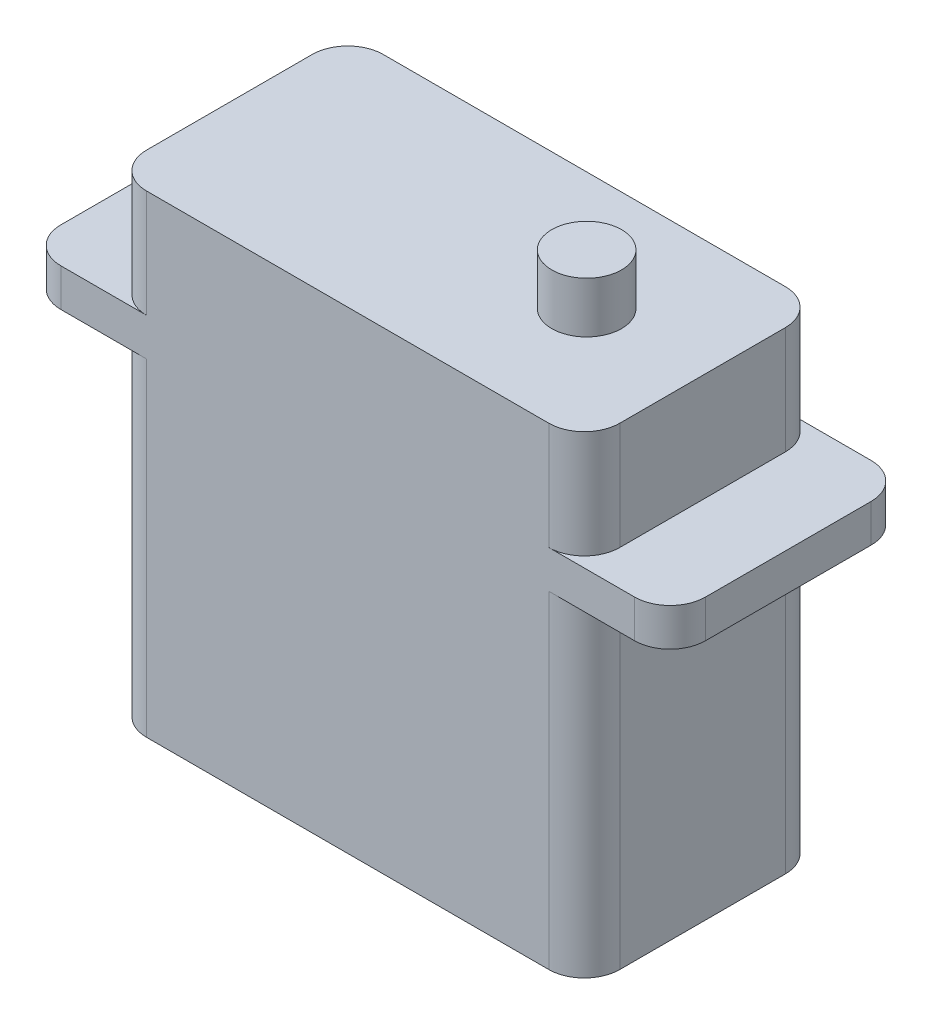
ISO-10303-21;
HEADER;
FILE_DESCRIPTION(('STEP AP214'),'2;1');
FILE_NAME('part.step','',(''),(''),'','','');
FILE_SCHEMA(('AUTOMOTIVE_DESIGN { 1 0 10303 214 1 1 1 1 }'));
ENDSEC;
DATA;
#1=APPLICATION_CONTEXT('core data for automotive mechanical design processes');
#2=APPLICATION_PROTOCOL_DEFINITION('international standard','automotive_design',2000,#1);
#3=PRODUCT_CONTEXT('',#1,'mechanical');
#4=PRODUCT('Part','Part','',(#3));
#5=PRODUCT_RELATED_PRODUCT_CATEGORY('part','',(#4));
#6=PRODUCT_DEFINITION_FORMATION('','',#4);
#7=PRODUCT_DEFINITION_CONTEXT('part definition',#1,'design');
#8=PRODUCT_DEFINITION('design','',#6,#7);
#9=PRODUCT_DEFINITION_SHAPE('','',#8);
#10=(LENGTH_UNIT() NAMED_UNIT(*) SI_UNIT(.MILLI.,.METRE.));
#11=(NAMED_UNIT(*) PLANE_ANGLE_UNIT() SI_UNIT($,.RADIAN.));
#12=(NAMED_UNIT(*) SI_UNIT($,.STERADIAN.) SOLID_ANGLE_UNIT());
#13=UNCERTAINTY_MEASURE_WITH_UNIT(LENGTH_MEASURE(1.E-05),#10,'distance_accuracy_value','');
#14=(GEOMETRIC_REPRESENTATION_CONTEXT(3) GLOBAL_UNCERTAINTY_ASSIGNED_CONTEXT((#13)) GLOBAL_UNIT_ASSIGNED_CONTEXT((#10,
#11,#12)) REPRESENTATION_CONTEXT('',''));
#15=CARTESIAN_POINT('',(0.,0.,0.));
#16=DIRECTION('',(0.,0.,1.));
#17=DIRECTION('',(1.,0.,0.));
#18=AXIS2_PLACEMENT_3D('',#15,#16,#17);
#19=CARTESIAN_POINT('',(20.,40.,10.));
#20=DIRECTION('',(-1.,0.,0.));
#21=DIRECTION('',(0.,0.,1.));
#22=AXIS2_PLACEMENT_3D('',#19,#20,#21);
#23=PLANE('',#22);
#24=DIRECTION('',(0.,0.,1.));
#25=VECTOR('',#24,1.);
#26=CARTESIAN_POINT('',(20.,30.9,10.));
#27=LINE('',#26,#25);
#28=CARTESIAN_POINT('',(20.,30.9,-7.));
#29=VERTEX_POINT('',#28);
#30=CARTESIAN_POINT('',(20.,30.9,7.));
#31=VERTEX_POINT('',#30);
#32=EDGE_CURVE('E341',#29,#31,#27,.T.);
#33=ORIENTED_EDGE('',*,*,#32,.F.);
#34=DIRECTION('',(0.,-1.,0.));
#35=VECTOR('',#34,1.);
#36=CARTESIAN_POINT('',(20.,40.,-7.));
#37=LINE('',#36,#35);
#38=CARTESIAN_POINT('',(20.,40.,-7.));
#39=VERTEX_POINT('',#38);
#40=EDGE_CURVE('E281',#29,#39,#37,.F.);
#41=ORIENTED_EDGE('',*,*,#40,.T.);
#42=DIRECTION('',(0.,0.,-1.));
#43=VECTOR('',#42,1.);
#44=CARTESIAN_POINT('',(20.,40.,10.));
#45=LINE('',#44,#43);
#46=CARTESIAN_POINT('',(20.,40.,7.));
#47=VERTEX_POINT('',#46);
#48=EDGE_CURVE('E370',#47,#39,#45,.T.);
#49=ORIENTED_EDGE('',*,*,#48,.F.);
#50=DIRECTION('',(0.,-1.,0.));
#51=VECTOR('',#50,1.);
#52=CARTESIAN_POINT('',(20.,40.,7.));
#53=LINE('',#52,#51);
#54=EDGE_CURVE('E278',#47,#31,#53,.T.);
#55=ORIENTED_EDGE('',*,*,#54,.T.);
#56=EDGE_LOOP('',(#33,#41,#49,#55));
#57=FACE_BOUND('',#56,.T.);
#58=ADVANCED_FACE('F35',(#57),#23,.F.);
#59=CARTESIAN_POINT('',(-20.,40.,10.));
#60=DIRECTION('',(1.,0.,0.));
#61=DIRECTION('',(0.,0.,-1.));
#62=AXIS2_PLACEMENT_3D('',#59,#60,#61);
#63=PLANE('',#62);
#64=DIRECTION('',(0.,0.,1.));
#65=VECTOR('',#64,1.);
#66=CARTESIAN_POINT('',(-20.,40.,10.));
#67=LINE('',#66,#65);
#68=CARTESIAN_POINT('',(-20.,40.,-7.));
#69=VERTEX_POINT('',#68);
#70=CARTESIAN_POINT('',(-20.,40.,7.));
#71=VERTEX_POINT('',#70);
#72=EDGE_CURVE('E352',#69,#71,#67,.T.);
#73=ORIENTED_EDGE('',*,*,#72,.F.);
#74=DIRECTION('',(0.,-1.,0.));
#75=VECTOR('',#74,1.);
#76=CARTESIAN_POINT('',(-20.,40.,-7.));
#77=LINE('',#76,#75);
#78=CARTESIAN_POINT('',(-20.,30.9,-7.));
#79=VERTEX_POINT('',#78);
#80=EDGE_CURVE('E301',#69,#79,#77,.T.);
#81=ORIENTED_EDGE('',*,*,#80,.T.);
#82=DIRECTION('',(0.,0.,-1.));
#83=VECTOR('',#82,1.);
#84=CARTESIAN_POINT('',(-20.,30.9,10.));
#85=LINE('',#84,#83);
#86=CARTESIAN_POINT('',(-20.,30.9,7.));
#87=VERTEX_POINT('',#86);
#88=EDGE_CURVE('E330',#87,#79,#85,.T.);
#89=ORIENTED_EDGE('',*,*,#88,.F.);
#90=DIRECTION('',(0.,-1.,0.));
#91=VECTOR('',#90,1.);
#92=CARTESIAN_POINT('',(-20.,40.,7.));
#93=LINE('',#92,#91);
#94=EDGE_CURVE('E299',#87,#71,#93,.F.);
#95=ORIENTED_EDGE('',*,*,#94,.T.);
#96=EDGE_LOOP('',(#73,#81,#89,#95));
#97=FACE_BOUND('',#96,.T.);
#98=ADVANCED_FACE('F338',(#97),#63,.F.);
#99=DIRECTION('',(0.,0.,-1.));
#100=VECTOR('',#99,1.);
#101=CARTESIAN_POINT('',(20.,0.,10.));
#102=LINE('',#101,#100);
#103=CARTESIAN_POINT('',(20.,0.,7.));
#104=VERTEX_POINT('',#103);
#105=CARTESIAN_POINT('',(20.,0.,-7.));
#106=VERTEX_POINT('',#105);
#107=EDGE_CURVE('E362',#104,#106,#102,.T.);
#108=ORIENTED_EDGE('',*,*,#107,.T.);
#109=DIRECTION('',(0.,-1.,0.));
#110=VECTOR('',#109,1.);
#111=CARTESIAN_POINT('',(20.,40.,-7.));
#112=LINE('',#111,#110);
#113=CARTESIAN_POINT('',(20.,27.7,-7.));
#114=VERTEX_POINT('',#113);
#115=EDGE_CURVE('E248',#106,#114,#112,.F.);
#116=ORIENTED_EDGE('',*,*,#115,.T.);
#117=DIRECTION('',(0.,0.,1.));
#118=VECTOR('',#117,1.);
#119=CARTESIAN_POINT('',(20.,27.7,10.));
#120=LINE('',#119,#118);
#121=CARTESIAN_POINT('',(20.,27.7,7.));
#122=VERTEX_POINT('',#121);
#123=EDGE_CURVE('E342',#114,#122,#120,.T.);
#124=ORIENTED_EDGE('',*,*,#123,.T.);
#125=DIRECTION('',(0.,-1.,0.));
#126=VECTOR('',#125,1.);
#127=CARTESIAN_POINT('',(20.,40.,7.));
#128=LINE('',#127,#126);
#129=EDGE_CURVE('E245',#122,#104,#128,.T.);
#130=ORIENTED_EDGE('',*,*,#129,.T.);
#131=EDGE_LOOP('',(#108,#116,#124,#130));
#132=FACE_BOUND('',#131,.T.);
#133=ADVANCED_FACE('F449',(#132),#23,.F.);
#134=CARTESIAN_POINT('',(-20.,40.,-10.));
#135=DIRECTION('',(0.,0.,1.));
#136=DIRECTION('',(1.,0.,0.));
#137=AXIS2_PLACEMENT_3D('',#134,#135,#136);
#138=PLANE('',#137);
#139=DIRECTION('',(-1.,0.,0.));
#140=VECTOR('',#139,1.);
#141=CARTESIAN_POINT('',(-27.25,27.7,-10.));
#142=LINE('',#141,#140);
#143=CARTESIAN_POINT('',(24.25,27.7,-10.));
#144=VERTEX_POINT('',#143);
#145=CARTESIAN_POINT('',(17.,27.7,-10.));
#146=VERTEX_POINT('',#145);
#147=EDGE_CURVE('E217',#144,#146,#142,.T.);
#148=ORIENTED_EDGE('',*,*,#147,.T.);
#149=DIRECTION('',(0.,-1.,0.));
#150=VECTOR('',#149,1.);
#151=CARTESIAN_POINT('',(17.,40.,-10.));
#152=LINE('',#151,#150);
#153=CARTESIAN_POINT('',(17.,0.,-10.));
#154=VERTEX_POINT('',#153);
#155=EDGE_CURVE('E234',#146,#154,#152,.T.);
#156=ORIENTED_EDGE('',*,*,#155,.T.);
#157=DIRECTION('',(-1.,0.,0.));
#158=VECTOR('',#157,1.);
#159=CARTESIAN_POINT('',(-20.,0.,-10.));
#160=LINE('',#159,#158);
#161=CARTESIAN_POINT('',(-17.,0.,-10.));
#162=VERTEX_POINT('',#161);
#163=EDGE_CURVE('E365',#154,#162,#160,.T.);
#164=ORIENTED_EDGE('',*,*,#163,.T.);
#165=DIRECTION('',(0.,-1.,0.));
#166=VECTOR('',#165,1.);
#167=CARTESIAN_POINT('',(-17.,40.,-10.));
#168=LINE('',#167,#166);
#169=CARTESIAN_POINT('',(-17.,27.7,-10.));
#170=VERTEX_POINT('',#169);
#171=EDGE_CURVE('E216',#162,#170,#168,.F.);
#172=ORIENTED_EDGE('',*,*,#171,.T.);
#173=CARTESIAN_POINT('',(-24.25,27.7,-10.));
#174=VERTEX_POINT('',#173);
#175=EDGE_CURVE('E199',#170,#174,#142,.T.);
#176=ORIENTED_EDGE('',*,*,#175,.T.);
#177=DIRECTION('',(0.,-1.,0.));
#178=VECTOR('',#177,1.);
#179=CARTESIAN_POINT('',(-24.25,40.,-10.));
#180=LINE('',#179,#178);
#181=CARTESIAN_POINT('',(-24.25,30.9,-10.));
#182=VERTEX_POINT('',#181);
#183=EDGE_CURVE('E212',#174,#182,#180,.F.);
#184=ORIENTED_EDGE('',*,*,#183,.T.);
#185=DIRECTION('',(-1.,0.,0.));
#186=VECTOR('',#185,1.);
#187=CARTESIAN_POINT('',(-27.25,30.9,-10.));
#188=LINE('',#187,#186);
#189=CARTESIAN_POINT('',(-17.,30.9,-10.));
#190=VERTEX_POINT('',#189);
#191=EDGE_CURVE('E386',#190,#182,#188,.T.);
#192=ORIENTED_EDGE('',*,*,#191,.F.);
#193=DIRECTION('',(0.,-1.,0.));
#194=VECTOR('',#193,1.);
#195=CARTESIAN_POINT('',(-17.,40.,-10.));
#196=LINE('',#195,#194);
#197=CARTESIAN_POINT('',(-17.,40.,-10.));
#198=VERTEX_POINT('',#197);
#199=EDGE_CURVE('E224',#190,#198,#196,.F.);
#200=ORIENTED_EDGE('',*,*,#199,.T.);
#201=DIRECTION('',(-1.,0.,0.));
#202=VECTOR('',#201,1.);
#203=CARTESIAN_POINT('',(-20.,40.,-10.));
#204=LINE('',#203,#202);
#205=CARTESIAN_POINT('',(17.,40.,-10.));
#206=VERTEX_POINT('',#205);
#207=EDGE_CURVE('E358',#206,#198,#204,.T.);
#208=ORIENTED_EDGE('',*,*,#207,.F.);
#209=DIRECTION('',(0.,-1.,0.));
#210=VECTOR('',#209,1.);
#211=CARTESIAN_POINT('',(17.,40.,-10.));
#212=LINE('',#211,#210);
#213=CARTESIAN_POINT('',(17.,30.9,-10.));
#214=VERTEX_POINT('',#213);
#215=EDGE_CURVE('E223',#206,#214,#212,.T.);
#216=ORIENTED_EDGE('',*,*,#215,.T.);
#217=CARTESIAN_POINT('',(24.25,30.9,-10.));
#218=VERTEX_POINT('',#217);
#219=EDGE_CURVE('E218',#218,#214,#188,.T.);
#220=ORIENTED_EDGE('',*,*,#219,.F.);
#221=DIRECTION('',(0.,-1.,0.));
#222=VECTOR('',#221,1.);
#223=CARTESIAN_POINT('',(24.25,27.7,-10.));
#224=LINE('',#223,#222);
#225=EDGE_CURVE('E227',#218,#144,#224,.T.);
#226=ORIENTED_EDGE('',*,*,#225,.T.);
#227=EDGE_LOOP('',(#148,#156,#164,#172,#176,#184,#192,#200,#208,#216,#220,#226));
#228=FACE_BOUND('',#227,.T.);
#229=ADVANCED_FACE('F211',(#228),#138,.F.);
#230=DIRECTION('',(0.,0.,-1.));
#231=VECTOR('',#230,1.);
#232=CARTESIAN_POINT('',(-20.,27.7,10.));
#233=LINE('',#232,#231);
#234=CARTESIAN_POINT('',(-20.,27.7,7.));
#235=VERTEX_POINT('',#234);
#236=CARTESIAN_POINT('',(-20.,27.7,-7.));
#237=VERTEX_POINT('',#236);
#238=EDGE_CURVE('E382',#235,#237,#233,.T.);
#239=ORIENTED_EDGE('',*,*,#238,.T.);
#240=DIRECTION('',(0.,-1.,0.));
#241=VECTOR('',#240,1.);
#242=CARTESIAN_POINT('',(-20.,40.,-7.));
#243=LINE('',#242,#241);
#244=CARTESIAN_POINT('',(-20.,0.,-7.));
#245=VERTEX_POINT('',#244);
#246=EDGE_CURVE('E305',#237,#245,#243,.T.);
#247=ORIENTED_EDGE('',*,*,#246,.T.);
#248=DIRECTION('',(0.,0.,1.));
#249=VECTOR('',#248,1.);
#250=CARTESIAN_POINT('',(-20.,0.,10.));
#251=LINE('',#250,#249);
#252=CARTESIAN_POINT('',(-20.,0.,7.));
#253=VERTEX_POINT('',#252);
#254=EDGE_CURVE('E367',#245,#253,#251,.T.);
#255=ORIENTED_EDGE('',*,*,#254,.T.);
#256=DIRECTION('',(0.,-1.,0.));
#257=VECTOR('',#256,1.);
#258=CARTESIAN_POINT('',(-20.,40.,7.));
#259=LINE('',#258,#257);
#260=EDGE_CURVE('E57',#253,#235,#259,.F.);
#261=ORIENTED_EDGE('',*,*,#260,.T.);
#262=EDGE_LOOP('',(#239,#247,#255,#261));
#263=FACE_BOUND('',#262,.T.);
#264=ADVANCED_FACE('F454',(#263),#63,.F.);
#265=CARTESIAN_POINT('',(-20.,40.,10.));
#266=DIRECTION('',(0.,0.,-1.));
#267=DIRECTION('',(-1.,0.,0.));
#268=AXIS2_PLACEMENT_3D('',#265,#266,#267);
#269=PLANE('',#268);
#270=DIRECTION('',(1.,0.,0.));
#271=VECTOR('',#270,1.);
#272=CARTESIAN_POINT('',(-20.,0.,10.));
#273=LINE('',#272,#271);
#274=CARTESIAN_POINT('',(-17.,0.,10.));
#275=VERTEX_POINT('',#274);
#276=CARTESIAN_POINT('',(17.,0.,10.));
#277=VERTEX_POINT('',#276);
#278=EDGE_CURVE('E369',#275,#277,#273,.T.);
#279=ORIENTED_EDGE('',*,*,#278,.T.);
#280=DIRECTION('',(0.,-1.,0.));
#281=VECTOR('',#280,1.);
#282=CARTESIAN_POINT('',(17.,40.,10.));
#283=LINE('',#282,#281);
#284=CARTESIAN_POINT('',(17.,27.7,10.));
#285=VERTEX_POINT('',#284);
#286=EDGE_CURVE('E263',#277,#285,#283,.F.);
#287=ORIENTED_EDGE('',*,*,#286,.T.);
#288=DIRECTION('',(1.,0.,0.));
#289=VECTOR('',#288,1.);
#290=CARTESIAN_POINT('',(-27.25,27.7,10.));
#291=LINE('',#290,#289);
#292=CARTESIAN_POINT('',(24.25,27.7,10.));
#293=VERTEX_POINT('',#292);
#294=EDGE_CURVE('E396',#285,#293,#291,.T.);
#295=ORIENTED_EDGE('',*,*,#294,.T.);
#296=DIRECTION('',(0.,1.,0.));
#297=VECTOR('',#296,1.);
#298=CARTESIAN_POINT('',(24.25,30.9,10.));
#299=LINE('',#298,#297);
#300=CARTESIAN_POINT('',(24.25,30.9,10.));
#301=VERTEX_POINT('',#300);
#302=EDGE_CURVE('E260',#293,#301,#299,.T.);
#303=ORIENTED_EDGE('',*,*,#302,.T.);
#304=DIRECTION('',(1.,0.,0.));
#305=VECTOR('',#304,1.);
#306=CARTESIAN_POINT('',(-27.25,30.9,10.));
#307=LINE('',#306,#305);
#308=CARTESIAN_POINT('',(17.,30.9,10.));
#309=VERTEX_POINT('',#308);
#310=EDGE_CURVE('E398',#309,#301,#307,.T.);
#311=ORIENTED_EDGE('',*,*,#310,.F.);
#312=DIRECTION('',(0.,-1.,0.));
#313=VECTOR('',#312,1.);
#314=CARTESIAN_POINT('',(17.,40.,10.));
#315=LINE('',#314,#313);
#316=CARTESIAN_POINT('',(17.,40.,10.));
#317=VERTEX_POINT('',#316);
#318=EDGE_CURVE('E258',#309,#317,#315,.F.);
#319=ORIENTED_EDGE('',*,*,#318,.T.);
#320=DIRECTION('',(1.,0.,0.));
#321=VECTOR('',#320,1.);
#322=CARTESIAN_POINT('',(-20.,40.,10.));
#323=LINE('',#322,#321);
#324=CARTESIAN_POINT('',(-17.,40.,10.));
#325=VERTEX_POINT('',#324);
#326=EDGE_CURVE('E350',#325,#317,#323,.T.);
#327=ORIENTED_EDGE('',*,*,#326,.F.);
#328=DIRECTION('',(0.,-1.,0.));
#329=VECTOR('',#328,1.);
#330=CARTESIAN_POINT('',(-17.,40.,10.));
#331=LINE('',#330,#329);
#332=CARTESIAN_POINT('',(-17.,30.9,10.));
#333=VERTEX_POINT('',#332);
#334=EDGE_CURVE('E250',#325,#333,#331,.T.);
#335=ORIENTED_EDGE('',*,*,#334,.T.);
#336=CARTESIAN_POINT('',(-24.25,30.9,10.));
#337=VERTEX_POINT('',#336);
#338=EDGE_CURVE('E332',#337,#333,#307,.T.);
#339=ORIENTED_EDGE('',*,*,#338,.F.);
#340=DIRECTION('',(0.,1.,0.));
#341=VECTOR('',#340,1.);
#342=CARTESIAN_POINT('',(-24.25,40.,10.));
#343=LINE('',#342,#341);
#344=CARTESIAN_POINT('',(-24.25,27.7,10.));
#345=VERTEX_POINT('',#344);
#346=EDGE_CURVE('E256',#337,#345,#343,.F.);
#347=ORIENTED_EDGE('',*,*,#346,.T.);
#348=CARTESIAN_POINT('',(-17.,27.7,10.));
#349=VERTEX_POINT('',#348);
#350=EDGE_CURVE('E394',#345,#349,#291,.T.);
#351=ORIENTED_EDGE('',*,*,#350,.T.);
#352=DIRECTION('',(0.,-1.,0.));
#353=VECTOR('',#352,1.);
#354=CARTESIAN_POINT('',(-17.,40.,10.));
#355=LINE('',#354,#353);
#356=EDGE_CURVE('E253',#349,#275,#355,.T.);
#357=ORIENTED_EDGE('',*,*,#356,.T.);
#358=EDGE_LOOP('',(#279,#287,#295,#303,#311,#319,#327,#335,#339,#347,#351,#357));
#359=FACE_BOUND('',#358,.T.);
#360=ADVANCED_FACE('F355',(#359),#269,.F.);
#361=CARTESIAN_POINT('',(0.,40.,0.));
#362=DIRECTION('',(0.,-1.,0.));
#363=DIRECTION('',(0.,0.,-1.));
#364=AXIS2_PLACEMENT_3D('',#361,#362,#363);
#365=PLANE('',#364);
#366=CARTESIAN_POINT('',(10.2,40.,0.));
#367=DIRECTION('',(0.,-1.,0.));
#368=DIRECTION('',(0.,0.,-1.));
#369=AXIS2_PLACEMENT_3D('',#366,#367,#368);
#370=CIRCLE('',#369,2.95);
#371=CARTESIAN_POINT('',(10.2,40.,-2.95));
#372=VERTEX_POINT('',#371);
#373=EDGE_CURVE('E11',#372,#372,#370,.F.);
#374=ORIENTED_EDGE('',*,*,#373,.F.);
#375=EDGE_LOOP('',(#374));
#376=FACE_BOUND('',#375,.T.);
#377=ORIENTED_EDGE('',*,*,#48,.T.);
#378=CARTESIAN_POINT('',(17.,40.,-7.));
#379=DIRECTION('',(0.,-1.,0.));
#380=DIRECTION('',(0.,0.,-1.));
#381=AXIS2_PLACEMENT_3D('',#378,#379,#380);
#382=CIRCLE('',#381,3.);
#383=EDGE_CURVE('E289',#39,#206,#382,.F.);
#384=ORIENTED_EDGE('',*,*,#383,.T.);
#385=ORIENTED_EDGE('',*,*,#207,.T.);
#386=CARTESIAN_POINT('',(-17.,40.,-7.));
#387=DIRECTION('',(0.,-1.,0.));
#388=DIRECTION('',(0.,0.,-1.));
#389=AXIS2_PLACEMENT_3D('',#386,#387,#388);
#390=CIRCLE('',#389,3.);
#391=EDGE_CURVE('E285',#198,#69,#390,.F.);
#392=ORIENTED_EDGE('',*,*,#391,.T.);
#393=ORIENTED_EDGE('',*,*,#72,.T.);
#394=CARTESIAN_POINT('',(-17.,40.,7.));
#395=DIRECTION('',(0.,-1.,0.));
#396=DIRECTION('',(0.,0.,-1.));
#397=AXIS2_PLACEMENT_3D('',#394,#395,#396);
#398=CIRCLE('',#397,3.);
#399=EDGE_CURVE('E283',#71,#325,#398,.F.);
#400=ORIENTED_EDGE('',*,*,#399,.T.);
#401=ORIENTED_EDGE('',*,*,#326,.T.);
#402=CARTESIAN_POINT('',(17.,40.,7.));
#403=DIRECTION('',(0.,-1.,0.));
#404=DIRECTION('',(0.,0.,-1.));
#405=AXIS2_PLACEMENT_3D('',#402,#403,#404);
#406=CIRCLE('',#405,3.);
#407=EDGE_CURVE('E287',#317,#47,#406,.F.);
#408=ORIENTED_EDGE('',*,*,#407,.T.);
#409=EDGE_LOOP('',(#377,#384,#385,#392,#393,#400,#401,#408));
#410=FACE_BOUND('',#409,.T.);
#411=ADVANCED_FACE('F349',(#376,#410),#365,.F.);
#412=CARTESIAN_POINT('',(0.,0.,0.));
#413=DIRECTION('',(0.,-1.,0.));
#414=DIRECTION('',(0.,0.,-1.));
#415=AXIS2_PLACEMENT_3D('',#412,#413,#414);
#416=PLANE('',#415);
#417=ORIENTED_EDGE('',*,*,#163,.F.);
#418=CARTESIAN_POINT('',(17.,0.,-7.));
#419=DIRECTION('',(0.,-1.,0.));
#420=DIRECTION('',(0.,0.,-1.));
#421=AXIS2_PLACEMENT_3D('',#418,#419,#420);
#422=CIRCLE('',#421,3.);
#423=EDGE_CURVE('E243',#154,#106,#422,.T.);
#424=ORIENTED_EDGE('',*,*,#423,.T.);
#425=ORIENTED_EDGE('',*,*,#107,.F.);
#426=CARTESIAN_POINT('',(17.,0.,7.));
#427=DIRECTION('',(0.,-1.,0.));
#428=DIRECTION('',(0.,0.,-1.));
#429=AXIS2_PLACEMENT_3D('',#426,#427,#428);
#430=CIRCLE('',#429,3.);
#431=EDGE_CURVE('E241',#104,#277,#430,.T.);
#432=ORIENTED_EDGE('',*,*,#431,.T.);
#433=ORIENTED_EDGE('',*,*,#278,.F.);
#434=CARTESIAN_POINT('',(-17.,0.,7.));
#435=DIRECTION('',(0.,-1.,0.));
#436=DIRECTION('',(0.,0.,-1.));
#437=AXIS2_PLACEMENT_3D('',#434,#435,#436);
#438=CIRCLE('',#437,3.);
#439=EDGE_CURVE('E237',#275,#253,#438,.T.);
#440=ORIENTED_EDGE('',*,*,#439,.T.);
#441=ORIENTED_EDGE('',*,*,#254,.F.);
#442=CARTESIAN_POINT('',(-17.,0.,-7.));
#443=DIRECTION('',(0.,-1.,0.));
#444=DIRECTION('',(0.,0.,-1.));
#445=AXIS2_PLACEMENT_3D('',#442,#443,#444);
#446=CIRCLE('',#445,3.);
#447=EDGE_CURVE('E239',#245,#162,#446,.T.);
#448=ORIENTED_EDGE('',*,*,#447,.T.);
#449=EDGE_LOOP('',(#417,#424,#425,#432,#433,#440,#441,#448));
#450=FACE_BOUND('',#449,.T.);
#451=ADVANCED_FACE('F475',(#450),#416,.T.);
#452=CARTESIAN_POINT('',(-27.25,27.7,-64.5938641240937));
#453=DIRECTION('',(1.,0.,0.));
#454=DIRECTION('',(0.,0.,-1.));
#455=AXIS2_PLACEMENT_3D('',#452,#453,#454);
#456=PLANE('',#455);
#457=DIRECTION('',(0.,0.,1.));
#458=VECTOR('',#457,1.);
#459=CARTESIAN_POINT('',(-27.25,27.7,-64.5938641240937));
#460=LINE('',#459,#458);
#461=CARTESIAN_POINT('',(-27.25,27.7,-7.));
#462=VERTEX_POINT('',#461);
#463=CARTESIAN_POINT('',(-27.25,27.7,7.00000000000001));
#464=VERTEX_POINT('',#463);
#465=EDGE_CURVE('E202',#462,#464,#460,.T.);
#466=ORIENTED_EDGE('',*,*,#465,.T.);
#467=DIRECTION('',(0.,1.,0.));
#468=VECTOR('',#467,1.);
#469=CARTESIAN_POINT('',(-27.25,27.7,7.00000000000001));
#470=LINE('',#469,#468);
#471=CARTESIAN_POINT('',(-27.25,30.9,7.00000000000001));
#472=VERTEX_POINT('',#471);
#473=EDGE_CURVE('E293',#464,#472,#470,.T.);
#474=ORIENTED_EDGE('',*,*,#473,.T.);
#475=DIRECTION('',(0.,0.,1.));
#476=VECTOR('',#475,1.);
#477=CARTESIAN_POINT('',(-27.25,30.9,-64.5938641240937));
#478=LINE('',#477,#476);
#479=CARTESIAN_POINT('',(-27.25,30.9,-7.));
#480=VERTEX_POINT('',#479);
#481=EDGE_CURVE('E384',#480,#472,#478,.T.);
#482=ORIENTED_EDGE('',*,*,#481,.F.);
#483=DIRECTION('',(0.,-1.,0.));
#484=VECTOR('',#483,1.);
#485=CARTESIAN_POINT('',(-27.25,27.7,-7.));
#486=LINE('',#485,#484);
#487=EDGE_CURVE('E291',#480,#462,#486,.T.);
#488=ORIENTED_EDGE('',*,*,#487,.T.);
#489=EDGE_LOOP('',(#466,#474,#482,#488));
#490=FACE_BOUND('',#489,.T.);
#491=ADVANCED_FACE('F564',(#490),#456,.F.);
#492=CARTESIAN_POINT('',(-27.25,27.7,-64.5938641240937));
#493=DIRECTION('',(0.,-1.,0.));
#494=DIRECTION('',(0.,0.,-1.));
#495=AXIS2_PLACEMENT_3D('',#492,#493,#494);
#496=PLANE('',#495);
#497=ORIENTED_EDGE('',*,*,#350,.F.);
#498=CARTESIAN_POINT('',(-24.25,27.7,7.00000000000001));
#499=DIRECTION('',(0.,-1.,0.));
#500=DIRECTION('',(0.,0.,-1.));
#501=AXIS2_PLACEMENT_3D('',#498,#499,#500);
#502=CIRCLE('',#501,3.);
#503=EDGE_CURVE('E207',#345,#464,#502,.T.);
#504=ORIENTED_EDGE('',*,*,#503,.T.);
#505=ORIENTED_EDGE('',*,*,#465,.F.);
#506=CARTESIAN_POINT('',(-24.25,27.7,-7.));
#507=DIRECTION('',(0.,-1.,0.));
#508=DIRECTION('',(0.,0.,-1.));
#509=AXIS2_PLACEMENT_3D('',#506,#507,#508);
#510=CIRCLE('',#509,3.);
#511=EDGE_CURVE('E195',#462,#174,#510,.T.);
#512=ORIENTED_EDGE('',*,*,#511,.T.);
#513=ORIENTED_EDGE('',*,*,#175,.F.);
#514=CARTESIAN_POINT('',(-17.,27.7,-7.));
#515=DIRECTION('',(0.,-1.,0.));
#516=DIRECTION('',(0.,0.,-1.));
#517=AXIS2_PLACEMENT_3D('',#514,#515,#516);
#518=CIRCLE('',#517,3.);
#519=EDGE_CURVE('E50',#170,#237,#518,.F.);
#520=ORIENTED_EDGE('',*,*,#519,.T.);
#521=ORIENTED_EDGE('',*,*,#238,.F.);
#522=CARTESIAN_POINT('',(-17.,27.7,7.));
#523=DIRECTION('',(0.,-1.,0.));
#524=DIRECTION('',(0.,0.,-1.));
#525=AXIS2_PLACEMENT_3D('',#522,#523,#524);
#526=CIRCLE('',#525,3.);
#527=EDGE_CURVE('E322',#235,#349,#526,.F.);
#528=ORIENTED_EDGE('',*,*,#527,.T.);
#529=EDGE_LOOP('',(#497,#504,#505,#512,#513,#520,#521,#528));
#530=FACE_BOUND('',#529,.T.);
#531=ADVANCED_FACE('F198',(#530),#496,.T.);
#532=CARTESIAN_POINT('',(-27.25,30.9,-64.5938641240937));
#533=DIRECTION('',(0.,-1.,0.));
#534=DIRECTION('',(0.,0.,-1.));
#535=AXIS2_PLACEMENT_3D('',#532,#533,#534);
#536=PLANE('',#535);
#537=ORIENTED_EDGE('',*,*,#481,.T.);
#538=CARTESIAN_POINT('',(-24.25,30.9,7.00000000000001));
#539=DIRECTION('',(0.,-1.,0.));
#540=DIRECTION('',(0.,0.,-1.));
#541=AXIS2_PLACEMENT_3D('',#538,#539,#540);
#542=CIRCLE('',#541,3.);
#543=EDGE_CURVE('E208',#472,#337,#542,.F.);
#544=ORIENTED_EDGE('',*,*,#543,.T.);
#545=ORIENTED_EDGE('',*,*,#338,.T.);
#546=CARTESIAN_POINT('',(-17.,30.9,7.));
#547=DIRECTION('',(0.,-1.,0.));
#548=DIRECTION('',(0.,0.,-1.));
#549=AXIS2_PLACEMENT_3D('',#546,#547,#548);
#550=CIRCLE('',#549,3.);
#551=EDGE_CURVE('E43',#333,#87,#550,.T.);
#552=ORIENTED_EDGE('',*,*,#551,.T.);
#553=ORIENTED_EDGE('',*,*,#88,.T.);
#554=CARTESIAN_POINT('',(-17.,30.9,-7.));
#555=DIRECTION('',(0.,-1.,0.));
#556=DIRECTION('',(0.,0.,-1.));
#557=AXIS2_PLACEMENT_3D('',#554,#555,#556);
#558=CIRCLE('',#557,3.);
#559=EDGE_CURVE('E318',#79,#190,#558,.T.);
#560=ORIENTED_EDGE('',*,*,#559,.T.);
#561=ORIENTED_EDGE('',*,*,#191,.T.);
#562=CARTESIAN_POINT('',(-24.25,30.9,-7.));
#563=DIRECTION('',(0.,-1.,0.));
#564=DIRECTION('',(0.,0.,-1.));
#565=AXIS2_PLACEMENT_3D('',#562,#563,#564);
#566=CIRCLE('',#565,3.);
#567=EDGE_CURVE('E222',#182,#480,#566,.F.);
#568=ORIENTED_EDGE('',*,*,#567,.T.);
#569=EDGE_LOOP('',(#537,#544,#545,#552,#553,#560,#561,#568));
#570=FACE_BOUND('',#569,.T.);
#571=ADVANCED_FACE('F329',(#570),#536,.F.);
#572=ORIENTED_EDGE('',*,*,#310,.T.);
#573=CARTESIAN_POINT('',(24.25,30.9,7.));
#574=DIRECTION('',(0.,-1.,0.));
#575=DIRECTION('',(0.,0.,-1.));
#576=AXIS2_PLACEMENT_3D('',#573,#574,#575);
#577=CIRCLE('',#576,3.);
#578=CARTESIAN_POINT('',(27.25,30.9,7.00000000000001));
#579=VERTEX_POINT('',#578);
#580=EDGE_CURVE('E268',#301,#579,#577,.F.);
#581=ORIENTED_EDGE('',*,*,#580,.T.);
#582=DIRECTION('',(0.,0.,1.));
#583=VECTOR('',#582,1.);
#584=CARTESIAN_POINT('',(27.25,30.9,-64.5938641240937));
#585=LINE('',#584,#583);
#586=CARTESIAN_POINT('',(27.25,30.9,-7.));
#587=VERTEX_POINT('',#586);
#588=EDGE_CURVE('E387',#587,#579,#585,.T.);
#589=ORIENTED_EDGE('',*,*,#588,.F.);
#590=CARTESIAN_POINT('',(24.25,30.9,-7.));
#591=DIRECTION('',(0.,-1.,0.));
#592=DIRECTION('',(0.,0.,-1.));
#593=AXIS2_PLACEMENT_3D('',#590,#591,#592);
#594=CIRCLE('',#593,3.);
#595=EDGE_CURVE('E266',#587,#218,#594,.F.);
#596=ORIENTED_EDGE('',*,*,#595,.T.);
#597=ORIENTED_EDGE('',*,*,#219,.T.);
#598=CARTESIAN_POINT('',(17.,30.9,-7.));
#599=DIRECTION('',(0.,-1.,0.));
#600=DIRECTION('',(0.,0.,-1.));
#601=AXIS2_PLACEMENT_3D('',#598,#599,#600);
#602=CIRCLE('',#601,3.);
#603=EDGE_CURVE('E313',#214,#29,#602,.T.);
#604=ORIENTED_EDGE('',*,*,#603,.T.);
#605=ORIENTED_EDGE('',*,*,#32,.T.);
#606=CARTESIAN_POINT('',(17.,30.9,7.));
#607=DIRECTION('',(0.,-1.,0.));
#608=DIRECTION('',(0.,0.,-1.));
#609=AXIS2_PLACEMENT_3D('',#606,#607,#608);
#610=CIRCLE('',#609,3.);
#611=EDGE_CURVE('E315',#31,#309,#610,.T.);
#612=ORIENTED_EDGE('',*,*,#611,.T.);
#613=EDGE_LOOP('',(#572,#581,#589,#596,#597,#604,#605,#612));
#614=FACE_BOUND('',#613,.T.);
#615=ADVANCED_FACE('F406',(#614),#536,.F.);
#616=DIRECTION('',(0.,0.,1.));
#617=VECTOR('',#616,1.);
#618=CARTESIAN_POINT('',(27.25,27.7,-64.5938641240937));
#619=LINE('',#618,#617);
#620=CARTESIAN_POINT('',(27.25,27.7,-7.));
#621=VERTEX_POINT('',#620);
#622=CARTESIAN_POINT('',(27.25,27.7,7.00000000000001));
#623=VERTEX_POINT('',#622);
#624=EDGE_CURVE('E390',#621,#623,#619,.T.);
#625=ORIENTED_EDGE('',*,*,#624,.T.);
#626=CARTESIAN_POINT('',(24.25,27.7,7.));
#627=DIRECTION('',(0.,-1.,0.));
#628=DIRECTION('',(0.,0.,-1.));
#629=AXIS2_PLACEMENT_3D('',#626,#627,#628);
#630=CIRCLE('',#629,3.);
#631=EDGE_CURVE('E276',#623,#293,#630,.T.);
#632=ORIENTED_EDGE('',*,*,#631,.T.);
#633=ORIENTED_EDGE('',*,*,#294,.F.);
#634=CARTESIAN_POINT('',(17.,27.7,7.));
#635=DIRECTION('',(0.,-1.,0.));
#636=DIRECTION('',(0.,0.,-1.));
#637=AXIS2_PLACEMENT_3D('',#634,#635,#636);
#638=CIRCLE('',#637,3.);
#639=EDGE_CURVE('E311',#285,#122,#638,.F.);
#640=ORIENTED_EDGE('',*,*,#639,.T.);
#641=ORIENTED_EDGE('',*,*,#123,.F.);
#642=CARTESIAN_POINT('',(17.,27.7,-7.));
#643=DIRECTION('',(0.,-1.,0.));
#644=DIRECTION('',(0.,0.,-1.));
#645=AXIS2_PLACEMENT_3D('',#642,#643,#644);
#646=CIRCLE('',#645,3.);
#647=EDGE_CURVE('E308',#114,#146,#646,.F.);
#648=ORIENTED_EDGE('',*,*,#647,.T.);
#649=ORIENTED_EDGE('',*,*,#147,.F.);
#650=CARTESIAN_POINT('',(24.25,27.7,-7.));
#651=DIRECTION('',(0.,-1.,0.));
#652=DIRECTION('',(0.,0.,-1.));
#653=AXIS2_PLACEMENT_3D('',#650,#651,#652);
#654=CIRCLE('',#653,3.);
#655=EDGE_CURVE('E274',#144,#621,#654,.T.);
#656=ORIENTED_EDGE('',*,*,#655,.T.);
#657=EDGE_LOOP('',(#625,#632,#633,#640,#641,#648,#649,#656));
#658=FACE_BOUND('',#657,.T.);
#659=ADVANCED_FACE('F419',(#658),#496,.T.);
#660=CARTESIAN_POINT('',(27.25,27.7,-64.5938641240937));
#661=DIRECTION('',(1.,0.,0.));
#662=DIRECTION('',(0.,1.,0.));
#663=AXIS2_PLACEMENT_3D('',#660,#661,#662);
#664=PLANE('',#663);
#665=ORIENTED_EDGE('',*,*,#588,.T.);
#666=DIRECTION('',(0.,1.,0.));
#667=VECTOR('',#666,1.);
#668=CARTESIAN_POINT('',(27.25,27.7,7.));
#669=LINE('',#668,#667);
#670=EDGE_CURVE('E272',#579,#623,#669,.F.);
#671=ORIENTED_EDGE('',*,*,#670,.T.);
#672=ORIENTED_EDGE('',*,*,#624,.F.);
#673=DIRECTION('',(0.,-1.,0.));
#674=VECTOR('',#673,1.);
#675=CARTESIAN_POINT('',(27.25,30.9,-7.));
#676=LINE('',#675,#674);
#677=EDGE_CURVE('E270',#621,#587,#676,.F.);
#678=ORIENTED_EDGE('',*,*,#677,.T.);
#679=EDGE_LOOP('',(#665,#671,#672,#678));
#680=FACE_BOUND('',#679,.T.);
#681=ADVANCED_FACE('F416',(#680),#664,.T.);
#682=CARTESIAN_POINT('',(17.,40.,-7.));
#683=DIRECTION('',(0.,-1.,0.));
#684=DIRECTION('',(0.,0.,-1.));
#685=AXIS2_PLACEMENT_3D('',#682,#683,#684);
#686=CYLINDRICAL_SURFACE('',#685,3.);
#687=ORIENTED_EDGE('',*,*,#647,.F.);
#688=ORIENTED_EDGE('',*,*,#115,.F.);
#689=ORIENTED_EDGE('',*,*,#423,.F.);
#690=ORIENTED_EDGE('',*,*,#155,.F.);
#691=EDGE_LOOP('',(#687,#688,#689,#690));
#692=FACE_BOUND('',#691,.T.);
#693=ADVANCED_FACE('F469',(#692),#686,.T.);
#694=CARTESIAN_POINT('',(17.,40.,7.));
#695=DIRECTION('',(0.,-1.,0.));
#696=DIRECTION('',(0.,0.,-1.));
#697=AXIS2_PLACEMENT_3D('',#694,#695,#696);
#698=CYLINDRICAL_SURFACE('',#697,3.);
#699=ORIENTED_EDGE('',*,*,#639,.F.);
#700=ORIENTED_EDGE('',*,*,#286,.F.);
#701=ORIENTED_EDGE('',*,*,#431,.F.);
#702=ORIENTED_EDGE('',*,*,#129,.F.);
#703=EDGE_LOOP('',(#699,#700,#701,#702));
#704=FACE_BOUND('',#703,.T.);
#705=ADVANCED_FACE('F473',(#704),#698,.T.);
#706=CARTESIAN_POINT('',(24.25,40.0000000000001,7.));
#707=DIRECTION('',(0.,-1.,0.));
#708=DIRECTION('',(1.,0.,0.));
#709=AXIS2_PLACEMENT_3D('',#706,#707,#708);
#710=CYLINDRICAL_SURFACE('',#709,3.);
#711=ORIENTED_EDGE('',*,*,#631,.F.);
#712=ORIENTED_EDGE('',*,*,#670,.F.);
#713=ORIENTED_EDGE('',*,*,#580,.F.);
#714=ORIENTED_EDGE('',*,*,#302,.F.);
#715=EDGE_LOOP('',(#711,#712,#713,#714));
#716=FACE_BOUND('',#715,.T.);
#717=ADVANCED_FACE('F412',(#716),#710,.T.);
#718=CARTESIAN_POINT('',(24.25,40.0000000000001,-7.));
#719=DIRECTION('',(0.,1.,0.));
#720=DIRECTION('',(-1.,0.,0.));
#721=AXIS2_PLACEMENT_3D('',#718,#719,#720);
#722=CYLINDRICAL_SURFACE('',#721,3.);
#723=ORIENTED_EDGE('',*,*,#595,.F.);
#724=ORIENTED_EDGE('',*,*,#677,.F.);
#725=ORIENTED_EDGE('',*,*,#655,.F.);
#726=ORIENTED_EDGE('',*,*,#225,.F.);
#727=EDGE_LOOP('',(#723,#724,#725,#726));
#728=FACE_BOUND('',#727,.T.);
#729=ADVANCED_FACE('F424',(#728),#722,.T.);
#730=CARTESIAN_POINT('',(17.,40.,-7.));
#731=DIRECTION('',(0.,-1.,0.));
#732=DIRECTION('',(0.,0.,-1.));
#733=AXIS2_PLACEMENT_3D('',#730,#731,#732);
#734=CYLINDRICAL_SURFACE('',#733,3.);
#735=ORIENTED_EDGE('',*,*,#383,.F.);
#736=ORIENTED_EDGE('',*,*,#40,.F.);
#737=ORIENTED_EDGE('',*,*,#603,.F.);
#738=ORIENTED_EDGE('',*,*,#215,.F.);
#739=EDGE_LOOP('',(#735,#736,#737,#738));
#740=FACE_BOUND('',#739,.T.);
#741=ADVANCED_FACE('F432',(#740),#734,.T.);
#742=CARTESIAN_POINT('',(17.,40.,7.));
#743=DIRECTION('',(0.,-1.,0.));
#744=DIRECTION('',(0.,0.,-1.));
#745=AXIS2_PLACEMENT_3D('',#742,#743,#744);
#746=CYLINDRICAL_SURFACE('',#745,3.);
#747=ORIENTED_EDGE('',*,*,#407,.F.);
#748=ORIENTED_EDGE('',*,*,#318,.F.);
#749=ORIENTED_EDGE('',*,*,#611,.F.);
#750=ORIENTED_EDGE('',*,*,#54,.F.);
#751=EDGE_LOOP('',(#747,#748,#749,#750));
#752=FACE_BOUND('',#751,.T.);
#753=ADVANCED_FACE('F436',(#752),#746,.T.);
#754=CARTESIAN_POINT('',(-24.25,27.7,7.00000000000001));
#755=DIRECTION('',(0.,1.,0.));
#756=DIRECTION('',(0.,0.,1.));
#757=AXIS2_PLACEMENT_3D('',#754,#755,#756);
#758=CYLINDRICAL_SURFACE('',#757,3.);
#759=ORIENTED_EDGE('',*,*,#503,.F.);
#760=ORIENTED_EDGE('',*,*,#346,.F.);
#761=ORIENTED_EDGE('',*,*,#543,.F.);
#762=ORIENTED_EDGE('',*,*,#473,.F.);
#763=EDGE_LOOP('',(#759,#760,#761,#762));
#764=FACE_BOUND('',#763,.T.);
#765=ADVANCED_FACE('F438',(#764),#758,.T.);
#766=CARTESIAN_POINT('',(-24.25,27.7,-7.));
#767=DIRECTION('',(0.,-1.,0.));
#768=DIRECTION('',(0.,0.,-1.));
#769=AXIS2_PLACEMENT_3D('',#766,#767,#768);
#770=CYLINDRICAL_SURFACE('',#769,3.);
#771=ORIENTED_EDGE('',*,*,#567,.F.);
#772=ORIENTED_EDGE('',*,*,#183,.F.);
#773=ORIENTED_EDGE('',*,*,#511,.F.);
#774=ORIENTED_EDGE('',*,*,#487,.F.);
#775=EDGE_LOOP('',(#771,#772,#773,#774));
#776=FACE_BOUND('',#775,.T.);
#777=ADVANCED_FACE('F221',(#776),#770,.T.);
#778=CARTESIAN_POINT('',(-17.,40.,-7.));
#779=DIRECTION('',(0.,-1.,0.));
#780=DIRECTION('',(0.,0.,-1.));
#781=AXIS2_PLACEMENT_3D('',#778,#779,#780);
#782=CYLINDRICAL_SURFACE('',#781,3.);
#783=ORIENTED_EDGE('',*,*,#391,.F.);
#784=ORIENTED_EDGE('',*,*,#199,.F.);
#785=ORIENTED_EDGE('',*,*,#559,.F.);
#786=ORIENTED_EDGE('',*,*,#80,.F.);
#787=EDGE_LOOP('',(#783,#784,#785,#786));
#788=FACE_BOUND('',#787,.T.);
#789=ADVANCED_FACE('F486',(#788),#782,.T.);
#790=CARTESIAN_POINT('',(-17.,40.,-7.));
#791=DIRECTION('',(0.,-1.,0.));
#792=DIRECTION('',(0.,0.,-1.));
#793=AXIS2_PLACEMENT_3D('',#790,#791,#792);
#794=CYLINDRICAL_SURFACE('',#793,3.);
#795=ORIENTED_EDGE('',*,*,#519,.F.);
#796=ORIENTED_EDGE('',*,*,#171,.F.);
#797=ORIENTED_EDGE('',*,*,#447,.F.);
#798=ORIENTED_EDGE('',*,*,#246,.F.);
#799=EDGE_LOOP('',(#795,#796,#797,#798));
#800=FACE_BOUND('',#799,.T.);
#801=ADVANCED_FACE('F484',(#800),#794,.T.);
#802=CARTESIAN_POINT('',(-17.,40.,7.));
#803=DIRECTION('',(0.,-1.,0.));
#804=DIRECTION('',(0.,0.,-1.));
#805=AXIS2_PLACEMENT_3D('',#802,#803,#804);
#806=CYLINDRICAL_SURFACE('',#805,3.);
#807=ORIENTED_EDGE('',*,*,#527,.F.);
#808=ORIENTED_EDGE('',*,*,#260,.F.);
#809=ORIENTED_EDGE('',*,*,#439,.F.);
#810=ORIENTED_EDGE('',*,*,#356,.F.);
#811=EDGE_LOOP('',(#807,#808,#809,#810));
#812=FACE_BOUND('',#811,.T.);
#813=ADVANCED_FACE('F481',(#812),#806,.T.);
#814=CARTESIAN_POINT('',(-17.,40.,7.));
#815=DIRECTION('',(0.,-1.,0.));
#816=DIRECTION('',(0.,0.,-1.));
#817=AXIS2_PLACEMENT_3D('',#814,#815,#816);
#818=CYLINDRICAL_SURFACE('',#817,3.);
#819=ORIENTED_EDGE('',*,*,#399,.F.);
#820=ORIENTED_EDGE('',*,*,#94,.F.);
#821=ORIENTED_EDGE('',*,*,#551,.F.);
#822=ORIENTED_EDGE('',*,*,#334,.F.);
#823=EDGE_LOOP('',(#819,#820,#821,#822));
#824=FACE_BOUND('',#823,.T.);
#825=ADVANCED_FACE('F37',(#824),#818,.T.);
#826=CARTESIAN_POINT('',(10.2,44.3,0.));
#827=DIRECTION('',(0.,-1.,0.));
#828=DIRECTION('',(0.,0.,-1.));
#829=AXIS2_PLACEMENT_3D('',#826,#827,#828);
#830=CYLINDRICAL_SURFACE('',#829,2.95);
#831=CARTESIAN_POINT('',(10.2,44.3,0.));
#832=DIRECTION('',(0.,1.,0.));
#833=DIRECTION('',(0.,0.,1.));
#834=AXIS2_PLACEMENT_3D('',#831,#832,#833);
#835=CIRCLE('',#834,2.95);
#836=CARTESIAN_POINT('',(10.2,44.3,-2.95));
#837=VERTEX_POINT('',#836);
#838=EDGE_CURVE('E400',#837,#837,#835,.T.);
#839=CARTESIAN_POINT('',(10.2,44.3,-2.95));
#840=CARTESIAN_POINT('',(10.2,44.2552083333333,-2.95));
#841=CARTESIAN_POINT('',(10.2,44.2104166666667,-2.95));
#842=CARTESIAN_POINT('',(10.2,44.1208333333333,-2.95));
#843=CARTESIAN_POINT('',(10.2,44.0760416666667,-2.95));
#844=CARTESIAN_POINT('',(10.2,43.9864583333333,-2.95));
#845=CARTESIAN_POINT('',(10.2,43.9416666666667,-2.95));
#846=CARTESIAN_POINT('',(10.2,43.8520833333333,-2.95));
#847=CARTESIAN_POINT('',(10.2,43.8072916666667,-2.95));
#848=CARTESIAN_POINT('',(10.2,43.7177083333333,-2.95));
#849=CARTESIAN_POINT('',(10.2,43.6729166666667,-2.95));
#850=CARTESIAN_POINT('',(10.2,43.5833333333333,-2.95));
#851=CARTESIAN_POINT('',(10.2,43.5385416666667,-2.95));
#852=CARTESIAN_POINT('',(10.2,43.4489583333333,-2.95));
#853=CARTESIAN_POINT('',(10.2,43.4041666666667,-2.95));
#854=CARTESIAN_POINT('',(10.2,43.3145833333333,-2.95));
#855=CARTESIAN_POINT('',(10.2,43.2697916666667,-2.95));
#856=CARTESIAN_POINT('',(10.2,43.1802083333333,-2.95));
#857=CARTESIAN_POINT('',(10.2,43.1354166666667,-2.95));
#858=CARTESIAN_POINT('',(10.2,43.0458333333333,-2.95));
#859=CARTESIAN_POINT('',(10.2,43.0010416666667,-2.95));
#860=CARTESIAN_POINT('',(10.2,42.9114583333333,-2.95));
#861=CARTESIAN_POINT('',(10.2,42.8666666666667,-2.95));
#862=CARTESIAN_POINT('',(10.2,42.7770833333333,-2.95));
#863=CARTESIAN_POINT('',(10.2,42.7322916666667,-2.95));
#864=CARTESIAN_POINT('',(10.2,42.6427083333333,-2.95));
#865=CARTESIAN_POINT('',(10.2,42.5979166666667,-2.95));
#866=CARTESIAN_POINT('',(10.2,42.5083333333333,-2.95));
#867=CARTESIAN_POINT('',(10.2,42.4635416666667,-2.95));
#868=CARTESIAN_POINT('',(10.2,42.3739583333333,-2.95));
#869=CARTESIAN_POINT('',(10.2,42.3291666666667,-2.95));
#870=CARTESIAN_POINT('',(10.2,42.2395833333333,-2.95));
#871=CARTESIAN_POINT('',(10.2,42.1947916666667,-2.95));
#872=CARTESIAN_POINT('',(10.2,42.1052083333333,-2.95));
#873=CARTESIAN_POINT('',(10.2,42.0604166666667,-2.95));
#874=CARTESIAN_POINT('',(10.2,41.9708333333333,-2.95));
#875=CARTESIAN_POINT('',(10.2,41.9260416666667,-2.95));
#876=CARTESIAN_POINT('',(10.2,41.8364583333333,-2.95));
#877=CARTESIAN_POINT('',(10.2,41.7916666666667,-2.95));
#878=CARTESIAN_POINT('',(10.2,41.7020833333333,-2.95));
#879=CARTESIAN_POINT('',(10.2,41.6572916666667,-2.95));
#880=CARTESIAN_POINT('',(10.2,41.5677083333333,-2.95));
#881=CARTESIAN_POINT('',(10.2,41.5229166666667,-2.95));
#882=CARTESIAN_POINT('',(10.2,41.4333333333333,-2.95));
#883=CARTESIAN_POINT('',(10.2,41.3885416666667,-2.95));
#884=CARTESIAN_POINT('',(10.2,41.2989583333333,-2.95));
#885=CARTESIAN_POINT('',(10.2,41.2541666666667,-2.95));
#886=CARTESIAN_POINT('',(10.2,41.1645833333333,-2.95));
#887=CARTESIAN_POINT('',(10.2,41.1197916666667,-2.95));
#888=CARTESIAN_POINT('',(10.2,41.0302083333333,-2.95));
#889=CARTESIAN_POINT('',(10.2,40.9854166666667,-2.95));
#890=CARTESIAN_POINT('',(10.2,40.8958333333333,-2.95));
#891=CARTESIAN_POINT('',(10.2,40.8510416666667,-2.95));
#892=CARTESIAN_POINT('',(10.2,40.7614583333333,-2.95));
#893=CARTESIAN_POINT('',(10.2,40.7166666666667,-2.95));
#894=CARTESIAN_POINT('',(10.2,40.6270833333333,-2.95));
#895=CARTESIAN_POINT('',(10.2,40.5822916666667,-2.95));
#896=CARTESIAN_POINT('',(10.2,40.4927083333333,-2.95));
#897=CARTESIAN_POINT('',(10.2,40.4479166666667,-2.95));
#898=CARTESIAN_POINT('',(10.2,40.3583333333333,-2.95));
#899=CARTESIAN_POINT('',(10.2,40.3135416666667,-2.95));
#900=CARTESIAN_POINT('',(10.2,40.2239583333333,-2.95));
#901=CARTESIAN_POINT('',(10.2,40.1791666666667,-2.95));
#902=CARTESIAN_POINT('',(10.2,40.0895833333333,-2.95));
#903=CARTESIAN_POINT('',(10.2,40.0447916666667,-2.95));
#904=CARTESIAN_POINT('',(10.2,40.,-2.95));
#905=B_SPLINE_CURVE_WITH_KNOTS('',3,(#839,#840,#841,#842,#843,#844,#845,#846,#847,#848,#849,
#850,#851,#852,#853,#854,#855,#856,#857,#858,#859,#860,#861,#862,#863,#864,#865,#866,#867,#868,
#869,#870,#871,#872,#873,#874,#875,#876,#877,#878,#879,#880,#881,#882,#883,#884,#885,#886,#887,
#888,#889,#890,#891,#892,#893,#894,#895,#896,#897,#898,#899,#900,#901,#902,#903,#904),
.UNSPECIFIED.,.F.,.F.,(4,2,2,2,2,2,2,2,2,2,2,2,2,2,2,2,2,2,2,2,2,2,2,2,2,2,2,2,2,2,2,2,4),(0.,
0.134375000000006,0.268750000000005,0.403125000000004,0.537500000000003,0.671875000000002,
0.806250000000001,0.940625,1.075,1.209375,1.34375,1.478125,1.6125,1.746875,1.88125,2.015625,
2.15,2.284375,2.41875,2.553125,2.6875,2.821875,2.95625,3.090625,3.225,3.359375,3.49375,3.628125,
3.76249999999999,3.89687499999999,4.03124999999999,4.165625,4.3),.UNSPECIFIED.);
#906=EDGE_CURVE('BSEAM523',#837,#372,#905,.T.);
#907=ORIENTED_EDGE('',*,*,#838,.F.);
#908=ORIENTED_EDGE('',*,*,#373,.T.);
#909=ORIENTED_EDGE('',*,*,#906,.T.);
#910=ORIENTED_EDGE('',*,*,#906,.F.);
#911=EDGE_LOOP('',(#907,#909,#908,#910));
#912=FACE_BOUND('',#911,.T.);
#913=ADVANCED_FACE('F523',(#912),#830,.T.);
#914=CARTESIAN_POINT('',(10.2,44.3,0.));
#915=DIRECTION('',(0.,1.,0.));
#916=DIRECTION('',(0.,0.,1.));
#917=AXIS2_PLACEMENT_3D('',#914,#915,#916);
#918=PLANE('',#917);
#919=ORIENTED_EDGE('',*,*,#838,.T.);
#920=EDGE_LOOP('',(#919));
#921=FACE_BOUND('',#920,.T.);
#922=ADVANCED_FACE('F544',(#921),#918,.T.);
#923=CLOSED_SHELL('',(#58,#98,#133,#229,#264,#360,#411,#451,#491,#531,#571,#615,#659,#681,#693,
#705,#717,#729,#741,#753,#765,#777,#789,#801,#813,#825,#913,#922));
#924=MANIFOLD_SOLID_BREP('B2',#923);
#925=ADVANCED_BREP_SHAPE_REPRESENTATION('',(#18,#924),#14);
#926=SHAPE_DEFINITION_REPRESENTATION(#9,#925);
ENDSEC;
END-ISO-10303-21;
